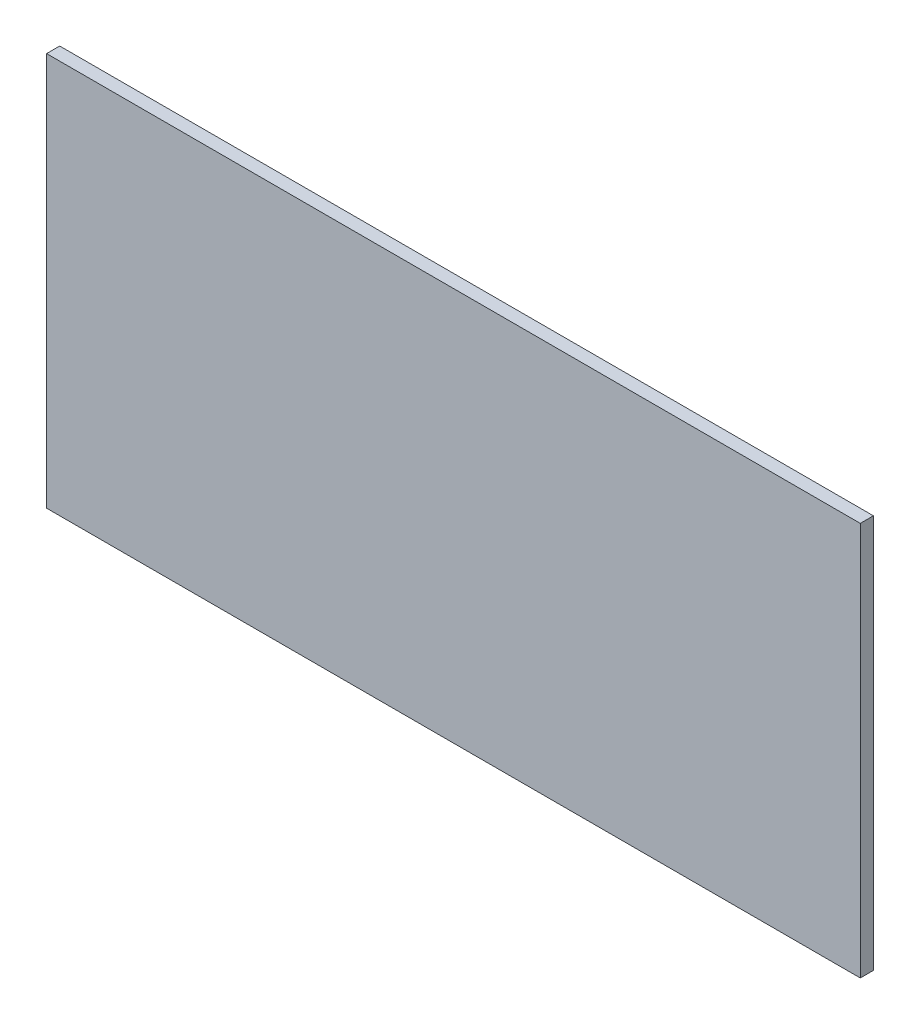
ISO-10303-21;
HEADER;
FILE_DESCRIPTION(('STEP AP214'),'2;1');
FILE_NAME('part.step','',(''),(''),'','','');
FILE_SCHEMA(('AUTOMOTIVE_DESIGN { 1 0 10303 214 1 1 1 1 }'));
ENDSEC;
DATA;
#1=APPLICATION_CONTEXT('core data for automotive mechanical design processes');
#2=APPLICATION_PROTOCOL_DEFINITION('international standard','automotive_design',2000,#1);
#3=PRODUCT_CONTEXT('',#1,'mechanical');
#4=PRODUCT('Part','Part','',(#3));
#5=PRODUCT_RELATED_PRODUCT_CATEGORY('part','',(#4));
#6=PRODUCT_DEFINITION_FORMATION('','',#4);
#7=PRODUCT_DEFINITION_CONTEXT('part definition',#1,'design');
#8=PRODUCT_DEFINITION('design','',#6,#7);
#9=PRODUCT_DEFINITION_SHAPE('','',#8);
#10=(LENGTH_UNIT() NAMED_UNIT(*) SI_UNIT(.MILLI.,.METRE.));
#11=(NAMED_UNIT(*) PLANE_ANGLE_UNIT() SI_UNIT($,.RADIAN.));
#12=(NAMED_UNIT(*) SI_UNIT($,.STERADIAN.) SOLID_ANGLE_UNIT());
#13=UNCERTAINTY_MEASURE_WITH_UNIT(LENGTH_MEASURE(1.E-05),#10,'distance_accuracy_value','');
#14=(GEOMETRIC_REPRESENTATION_CONTEXT(3) GLOBAL_UNCERTAINTY_ASSIGNED_CONTEXT((#13)) GLOBAL_UNIT_ASSIGNED_CONTEXT((#10,
#11,#12)) REPRESENTATION_CONTEXT('',''));
#15=CARTESIAN_POINT('',(0.,0.,0.));
#16=DIRECTION('',(0.,0.,1.));
#17=DIRECTION('',(1.,0.,0.));
#18=AXIS2_PLACEMENT_3D('',#15,#16,#17);
#19=CARTESIAN_POINT('',(-62.,60.,92.));
#20=DIRECTION('',(1.,0.,0.));
#21=DIRECTION('',(0.,0.,-1.));
#22=AXIS2_PLACEMENT_3D('',#19,#20,#21);
#23=PLANE('',#22);
#24=DIRECTION('',(0.,-1.,0.));
#25=VECTOR('',#24,1.);
#26=CARTESIAN_POINT('',(-62.,60.,90.));
#27=LINE('',#26,#25);
#28=CARTESIAN_POINT('',(-62.,60.,90.));
#29=VERTEX_POINT('',#28);
#30=CARTESIAN_POINT('',(-62.,0.,90.));
#31=VERTEX_POINT('',#30);
#32=EDGE_CURVE('E147',#29,#31,#27,.T.);
#33=ORIENTED_EDGE('',*,*,#32,.T.);
#34=DIRECTION('',(0.,0.,-1.));
#35=VECTOR('',#34,1.);
#36=CARTESIAN_POINT('',(-62.,0.,92.));
#37=LINE('',#36,#35);
#38=CARTESIAN_POINT('',(-62.,0.,92.));
#39=VERTEX_POINT('',#38);
#40=EDGE_CURVE('E12',#39,#31,#37,.T.);
#41=ORIENTED_EDGE('',*,*,#40,.F.);
#42=DIRECTION('',(0.,-1.,0.));
#43=VECTOR('',#42,1.);
#44=CARTESIAN_POINT('',(-62.,60.,92.));
#45=LINE('',#44,#43);
#46=CARTESIAN_POINT('',(-62.,60.,92.));
#47=VERTEX_POINT('',#46);
#48=EDGE_CURVE('E103',#47,#39,#45,.T.);
#49=ORIENTED_EDGE('',*,*,#48,.F.);
#50=DIRECTION('',(0.,0.,-1.));
#51=VECTOR('',#50,1.);
#52=CARTESIAN_POINT('',(-62.,60.,92.));
#53=LINE('',#52,#51);
#54=EDGE_CURVE('E64',#47,#29,#53,.T.);
#55=ORIENTED_EDGE('',*,*,#54,.T.);
#56=EDGE_LOOP('',(#33,#41,#49,#55));
#57=FACE_BOUND('',#56,.T.);
#58=ADVANCED_FACE('F43',(#57),#23,.F.);
#59=CARTESIAN_POINT('',(-62.,0.,92.));
#60=DIRECTION('',(0.,1.,0.));
#61=DIRECTION('',(0.,0.,1.));
#62=AXIS2_PLACEMENT_3D('',#59,#60,#61);
#63=PLANE('',#62);
#64=DIRECTION('',(1.,0.,0.));
#65=VECTOR('',#64,1.);
#66=CARTESIAN_POINT('',(-62.,0.,90.));
#67=LINE('',#66,#65);
#68=CARTESIAN_POINT('',(62.,0.,90.));
#69=VERTEX_POINT('',#68);
#70=EDGE_CURVE('E109',#31,#69,#67,.T.);
#71=ORIENTED_EDGE('',*,*,#70,.T.);
#72=DIRECTION('',(0.,0.,-1.));
#73=VECTOR('',#72,1.);
#74=CARTESIAN_POINT('',(62.,0.,92.));
#75=LINE('',#74,#73);
#76=CARTESIAN_POINT('',(62.,0.,92.));
#77=VERTEX_POINT('',#76);
#78=EDGE_CURVE('E54',#77,#69,#75,.T.);
#79=ORIENTED_EDGE('',*,*,#78,.F.);
#80=DIRECTION('',(1.,0.,0.));
#81=VECTOR('',#80,1.);
#82=CARTESIAN_POINT('',(-62.,0.,92.));
#83=LINE('',#82,#81);
#84=EDGE_CURVE('E95',#39,#77,#83,.T.);
#85=ORIENTED_EDGE('',*,*,#84,.F.);
#86=ORIENTED_EDGE('',*,*,#40,.T.);
#87=EDGE_LOOP('',(#71,#79,#85,#86));
#88=FACE_BOUND('',#87,.T.);
#89=ADVANCED_FACE('F108',(#88),#63,.F.);
#90=CARTESIAN_POINT('',(62.,60.,92.));
#91=DIRECTION('',(1.,0.,0.));
#92=DIRECTION('',(0.,0.,-1.));
#93=AXIS2_PLACEMENT_3D('',#90,#91,#92);
#94=PLANE('',#93);
#95=DIRECTION('',(0.,-1.,0.));
#96=VECTOR('',#95,1.);
#97=CARTESIAN_POINT('',(62.,60.,90.));
#98=LINE('',#97,#96);
#99=CARTESIAN_POINT('',(62.,60.,90.));
#100=VERTEX_POINT('',#99);
#101=EDGE_CURVE('E133',#100,#69,#98,.T.);
#102=ORIENTED_EDGE('',*,*,#101,.F.);
#103=DIRECTION('',(0.,0.,-1.));
#104=VECTOR('',#103,1.);
#105=CARTESIAN_POINT('',(62.,60.,92.));
#106=LINE('',#105,#104);
#107=CARTESIAN_POINT('',(62.,60.,92.));
#108=VERTEX_POINT('',#107);
#109=EDGE_CURVE('E82',#108,#100,#106,.T.);
#110=ORIENTED_EDGE('',*,*,#109,.F.);
#111=DIRECTION('',(0.,-1.,0.));
#112=VECTOR('',#111,1.);
#113=CARTESIAN_POINT('',(62.,60.,92.));
#114=LINE('',#113,#112);
#115=EDGE_CURVE('E102',#108,#77,#114,.T.);
#116=ORIENTED_EDGE('',*,*,#115,.T.);
#117=ORIENTED_EDGE('',*,*,#78,.T.);
#118=EDGE_LOOP('',(#102,#110,#116,#117));
#119=FACE_BOUND('',#118,.T.);
#120=ADVANCED_FACE('F113',(#119),#94,.T.);
#121=CARTESIAN_POINT('',(-62.,60.,92.));
#122=DIRECTION('',(0.,1.,0.));
#123=DIRECTION('',(0.,0.,1.));
#124=AXIS2_PLACEMENT_3D('',#121,#122,#123);
#125=PLANE('',#124);
#126=DIRECTION('',(1.,0.,0.));
#127=VECTOR('',#126,1.);
#128=CARTESIAN_POINT('',(-62.,60.,90.));
#129=LINE('',#128,#127);
#130=EDGE_CURVE('E138',#29,#100,#129,.T.);
#131=ORIENTED_EDGE('',*,*,#130,.F.);
#132=ORIENTED_EDGE('',*,*,#54,.F.);
#133=DIRECTION('',(1.,0.,0.));
#134=VECTOR('',#133,1.);
#135=CARTESIAN_POINT('',(-62.,60.,92.));
#136=LINE('',#135,#134);
#137=EDGE_CURVE('E115',#47,#108,#136,.T.);
#138=ORIENTED_EDGE('',*,*,#137,.T.);
#139=ORIENTED_EDGE('',*,*,#109,.T.);
#140=EDGE_LOOP('',(#131,#132,#138,#139));
#141=FACE_BOUND('',#140,.T.);
#142=ADVANCED_FACE('F159',(#141),#125,.T.);
#143=CARTESIAN_POINT('',(0.,0.,92.));
#144=DIRECTION('',(0.,0.,1.));
#145=DIRECTION('',(1.,0.,0.));
#146=AXIS2_PLACEMENT_3D('',#143,#144,#145);
#147=PLANE('',#146);
#148=ORIENTED_EDGE('',*,*,#48,.T.);
#149=ORIENTED_EDGE('',*,*,#84,.T.);
#150=ORIENTED_EDGE('',*,*,#115,.F.);
#151=ORIENTED_EDGE('',*,*,#137,.F.);
#152=EDGE_LOOP('',(#148,#149,#150,#151));
#153=FACE_BOUND('',#152,.T.);
#154=ADVANCED_FACE('F99',(#153),#147,.T.);
#155=CARTESIAN_POINT('',(0.,0.,90.));
#156=DIRECTION('',(0.,0.,1.));
#157=DIRECTION('',(1.,0.,0.));
#158=AXIS2_PLACEMENT_3D('',#155,#156,#157);
#159=PLANE('',#158);
#160=ORIENTED_EDGE('',*,*,#32,.F.);
#161=ORIENTED_EDGE('',*,*,#130,.T.);
#162=ORIENTED_EDGE('',*,*,#101,.T.);
#163=ORIENTED_EDGE('',*,*,#70,.F.);
#164=EDGE_LOOP('',(#160,#161,#162,#163));
#165=FACE_BOUND('',#164,.T.);
#166=ADVANCED_FACE('F158',(#165),#159,.F.);
#167=CLOSED_SHELL('',(#58,#89,#120,#142,#154,#166));
#168=MANIFOLD_SOLID_BREP('B2',#167);
#169=ADVANCED_BREP_SHAPE_REPRESENTATION('',(#18,#168),#14);
#170=SHAPE_DEFINITION_REPRESENTATION(#9,#169);
ENDSEC;
END-ISO-10303-21;
